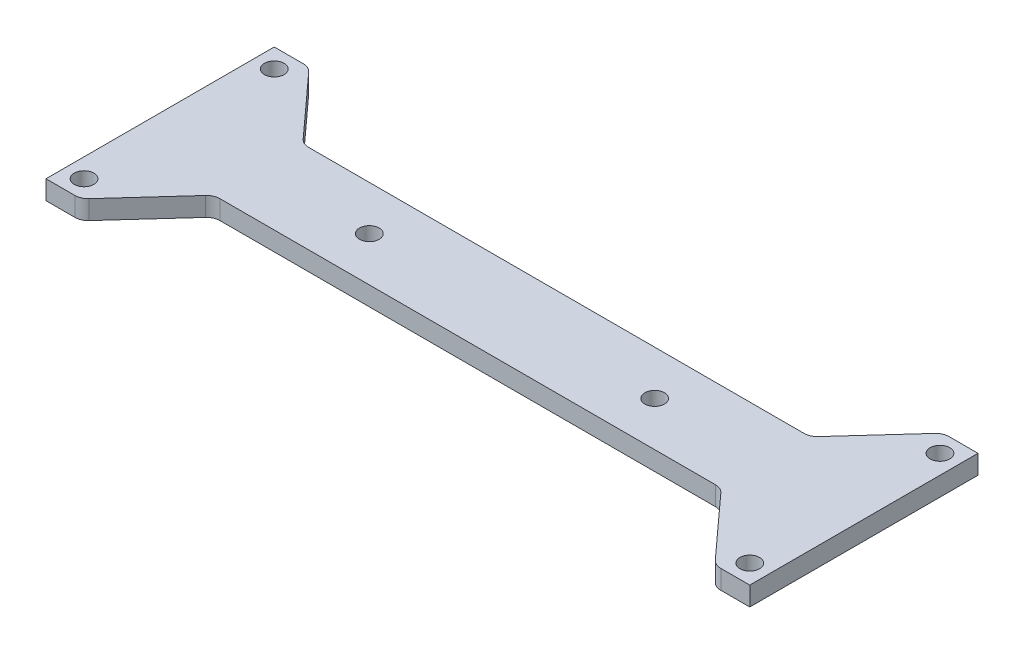
ISO-10303-21;
HEADER;
FILE_DESCRIPTION(('STEP AP214'),'2;1');
FILE_NAME('part.step','',(''),(''),'','','');
FILE_SCHEMA(('AUTOMOTIVE_DESIGN { 1 0 10303 214 1 1 1 1 }'));
ENDSEC;
DATA;
#1=APPLICATION_CONTEXT('core data for automotive mechanical design processes');
#2=APPLICATION_PROTOCOL_DEFINITION('international standard','automotive_design',2000,#1);
#3=PRODUCT_CONTEXT('',#1,'mechanical');
#4=PRODUCT('Part','Part','',(#3));
#5=PRODUCT_RELATED_PRODUCT_CATEGORY('part','',(#4));
#6=PRODUCT_DEFINITION_FORMATION('','',#4);
#7=PRODUCT_DEFINITION_CONTEXT('part definition',#1,'design');
#8=PRODUCT_DEFINITION('design','',#6,#7);
#9=PRODUCT_DEFINITION_SHAPE('','',#8);
#10=(LENGTH_UNIT() NAMED_UNIT(*) SI_UNIT(.MILLI.,.METRE.));
#11=(NAMED_UNIT(*) PLANE_ANGLE_UNIT() SI_UNIT($,.RADIAN.));
#12=(NAMED_UNIT(*) SI_UNIT($,.STERADIAN.) SOLID_ANGLE_UNIT());
#13=UNCERTAINTY_MEASURE_WITH_UNIT(LENGTH_MEASURE(1.E-05),#10,'distance_accuracy_value','');
#14=(GEOMETRIC_REPRESENTATION_CONTEXT(3) GLOBAL_UNCERTAINTY_ASSIGNED_CONTEXT((#13)) GLOBAL_UNIT_ASSIGNED_CONTEXT((#10,
#11,#12)) REPRESENTATION_CONTEXT('',''));
#15=CARTESIAN_POINT('',(0.,0.,0.));
#16=DIRECTION('',(0.,0.,1.));
#17=DIRECTION('',(1.,0.,0.));
#18=AXIS2_PLACEMENT_3D('',#15,#16,#17);
#19=CARTESIAN_POINT('',(-55.5,3.,-18.));
#20=DIRECTION('',(0.,0.,1.));
#21=DIRECTION('',(1.,0.,0.));
#22=AXIS2_PLACEMENT_3D('',#19,#20,#21);
#23=PLANE('',#22);
#24=DIRECTION('',(-1.,0.,0.));
#25=VECTOR('',#24,1.);
#26=CARTESIAN_POINT('',(-55.5,0.,-18.));
#27=LINE('',#26,#25);
#28=CARTESIAN_POINT('',(55.5,0.,-18.));
#29=VERTEX_POINT('',#28);
#30=CARTESIAN_POINT('',(50.9289767608517,0.,-18.));
#31=VERTEX_POINT('',#30);
#32=EDGE_CURVE('E430',#29,#31,#27,.T.);
#33=ORIENTED_EDGE('',*,*,#32,.T.);
#34=DIRECTION('',(0.,1.,0.));
#35=VECTOR('',#34,1.);
#36=CARTESIAN_POINT('',(50.9289767608517,3.,-18.));
#37=LINE('',#36,#35);
#38=CARTESIAN_POINT('',(50.9289767608517,3.,-18.));
#39=VERTEX_POINT('',#38);
#40=EDGE_CURVE('E186',#31,#39,#37,.T.);
#41=ORIENTED_EDGE('',*,*,#40,.T.);
#42=DIRECTION('',(-1.,0.,0.));
#43=VECTOR('',#42,1.);
#44=CARTESIAN_POINT('',(-55.5,3.,-18.));
#45=LINE('',#44,#43);
#46=CARTESIAN_POINT('',(55.5,3.,-18.));
#47=VERTEX_POINT('',#46);
#48=EDGE_CURVE('E179',#47,#39,#45,.T.);
#49=ORIENTED_EDGE('',*,*,#48,.F.);
#50=DIRECTION('',(0.,-1.,0.));
#51=VECTOR('',#50,1.);
#52=CARTESIAN_POINT('',(55.5,3.,-18.));
#53=LINE('',#52,#51);
#54=EDGE_CURVE('E183',#47,#29,#53,.T.);
#55=ORIENTED_EDGE('',*,*,#54,.T.);
#56=EDGE_LOOP('',(#33,#41,#49,#55));
#57=FACE_BOUND('',#56,.T.);
#58=ADVANCED_FACE('F39',(#57),#23,.F.);
#59=CARTESIAN_POINT('',(-55.5,3.,18.));
#60=DIRECTION('',(0.,0.,-1.));
#61=DIRECTION('',(-1.,0.,0.));
#62=AXIS2_PLACEMENT_3D('',#59,#60,#61);
#63=PLANE('',#62);
#64=DIRECTION('',(1.,0.,0.));
#65=VECTOR('',#64,1.);
#66=CARTESIAN_POINT('',(-55.5,3.,18.));
#67=LINE('',#66,#65);
#68=CARTESIAN_POINT('',(50.9289767608517,3.,18.));
#69=VERTEX_POINT('',#68);
#70=CARTESIAN_POINT('',(55.5,3.,18.));
#71=VERTEX_POINT('',#70);
#72=EDGE_CURVE('E197',#69,#71,#67,.T.);
#73=ORIENTED_EDGE('',*,*,#72,.F.);
#74=DIRECTION('',(0.,1.,0.));
#75=VECTOR('',#74,1.);
#76=CARTESIAN_POINT('',(50.9289767608517,3.,18.));
#77=LINE('',#76,#75);
#78=CARTESIAN_POINT('',(50.9289767608517,0.,18.));
#79=VERTEX_POINT('',#78);
#80=EDGE_CURVE('E262',#69,#79,#77,.F.);
#81=ORIENTED_EDGE('',*,*,#80,.T.);
#82=DIRECTION('',(1.,0.,0.));
#83=VECTOR('',#82,1.);
#84=CARTESIAN_POINT('',(-55.5,0.,18.));
#85=LINE('',#84,#83);
#86=CARTESIAN_POINT('',(55.5,0.,18.));
#87=VERTEX_POINT('',#86);
#88=EDGE_CURVE('E436',#79,#87,#85,.T.);
#89=ORIENTED_EDGE('',*,*,#88,.T.);
#90=DIRECTION('',(0.,-1.,0.));
#91=VECTOR('',#90,1.);
#92=CARTESIAN_POINT('',(55.5,3.,18.));
#93=LINE('',#92,#91);
#94=EDGE_CURVE('E426',#71,#87,#93,.T.);
#95=ORIENTED_EDGE('',*,*,#94,.F.);
#96=EDGE_LOOP('',(#73,#81,#89,#95));
#97=FACE_BOUND('',#96,.T.);
#98=ADVANCED_FACE('F470',(#97),#63,.F.);
#99=CARTESIAN_POINT('',(0.,3.,0.));
#100=DIRECTION('',(0.,1.,0.));
#101=DIRECTION('',(0.,0.,1.));
#102=AXIS2_PLACEMENT_3D('',#99,#100,#101);
#103=PLANE('',#102);
#104=ORIENTED_EDGE('',*,*,#48,.T.);
#105=CARTESIAN_POINT('',(50.9289767608517,3.,-15.9));
#106=DIRECTION('',(0.,1.,0.));
#107=DIRECTION('',(0.,0.,1.));
#108=AXIS2_PLACEMENT_3D('',#105,#106,#107);
#109=CIRCLE('',#108,2.1);
#110=CARTESIAN_POINT('',(49.3751026067202,3.,-17.3126128673923));
#111=VERTEX_POINT('',#110);
#112=EDGE_CURVE('E227',#39,#111,#109,.T.);
#113=ORIENTED_EDGE('',*,*,#112,.T.);
#114=DIRECTION('',(0.672672793996313,0.,-0.739940073395944));
#115=VECTOR('',#114,1.);
#116=CARTESIAN_POINT('',(40.,3.,-7.));
#117=LINE('',#116,#115);
#118=CARTESIAN_POINT('',(40.6248973932798,3.,-7.68738713260774));
#119=VERTEX_POINT('',#118);
#120=EDGE_CURVE('E342',#119,#111,#117,.T.);
#121=ORIENTED_EDGE('',*,*,#120,.F.);
#122=CARTESIAN_POINT('',(39.0710232391483,3.,-9.1));
#123=DIRECTION('',(0.,1.,0.));
#124=DIRECTION('',(0.,0.,1.));
#125=AXIS2_PLACEMENT_3D('',#122,#123,#124);
#126=CIRCLE('',#125,2.1);
#127=CARTESIAN_POINT('',(39.0710232391483,3.,-7.));
#128=VERTEX_POINT('',#127);
#129=EDGE_CURVE('E292',#119,#128,#126,.F.);
#130=ORIENTED_EDGE('',*,*,#129,.T.);
#131=DIRECTION('',(1.,0.,0.));
#132=VECTOR('',#131,1.);
#133=CARTESIAN_POINT('',(-40.,3.,-7.));
#134=LINE('',#133,#132);
#135=CARTESIAN_POINT('',(-39.0710232391483,3.,-7.));
#136=VERTEX_POINT('',#135);
#137=EDGE_CURVE('E314',#136,#128,#134,.T.);
#138=ORIENTED_EDGE('',*,*,#137,.F.);
#139=CARTESIAN_POINT('',(-39.0710232391483,3.,-9.1));
#140=DIRECTION('',(0.,1.,0.));
#141=DIRECTION('',(0.,0.,1.));
#142=AXIS2_PLACEMENT_3D('',#139,#140,#141);
#143=CIRCLE('',#142,2.1);
#144=CARTESIAN_POINT('',(-40.6248973932798,3.,-7.68738713260774));
#145=VERTEX_POINT('',#144);
#146=EDGE_CURVE('E48',#136,#145,#143,.F.);
#147=ORIENTED_EDGE('',*,*,#146,.T.);
#148=DIRECTION('',(0.672672793996313,0.,0.739940073395944));
#149=VECTOR('',#148,1.);
#150=CARTESIAN_POINT('',(-50.,3.,-18.));
#151=LINE('',#150,#149);
#152=CARTESIAN_POINT('',(-49.3751026067202,3.,-17.3126128673923));
#153=VERTEX_POINT('',#152);
#154=EDGE_CURVE('E312',#153,#145,#151,.T.);
#155=ORIENTED_EDGE('',*,*,#154,.F.);
#156=CARTESIAN_POINT('',(-50.9289767608517,3.,-15.9));
#157=DIRECTION('',(0.,1.,0.));
#158=DIRECTION('',(0.,0.,1.));
#159=AXIS2_PLACEMENT_3D('',#156,#157,#158);
#160=CIRCLE('',#159,2.1);
#161=CARTESIAN_POINT('',(-50.9289767608517,3.,-18.));
#162=VERTEX_POINT('',#161);
#163=EDGE_CURVE('E212',#153,#162,#160,.T.);
#164=ORIENTED_EDGE('',*,*,#163,.T.);
#165=CARTESIAN_POINT('',(-55.5,3.,-18.));
#166=VERTEX_POINT('',#165);
#167=EDGE_CURVE('E190',#162,#166,#45,.T.);
#168=ORIENTED_EDGE('',*,*,#167,.T.);
#169=DIRECTION('',(0.,0.,1.));
#170=VECTOR('',#169,1.);
#171=CARTESIAN_POINT('',(-55.5,3.,-18.));
#172=LINE('',#171,#170);
#173=CARTESIAN_POINT('',(-55.5,3.,18.));
#174=VERTEX_POINT('',#173);
#175=EDGE_CURVE('E189',#166,#174,#172,.T.);
#176=ORIENTED_EDGE('',*,*,#175,.T.);
#177=CARTESIAN_POINT('',(-50.9289767608517,3.,18.));
#178=VERTEX_POINT('',#177);
#179=EDGE_CURVE('E422',#174,#178,#67,.T.);
#180=ORIENTED_EDGE('',*,*,#179,.T.);
#181=CARTESIAN_POINT('',(-50.9289767608517,3.,15.9));
#182=DIRECTION('',(0.,1.,0.));
#183=DIRECTION('',(0.,0.,1.));
#184=AXIS2_PLACEMENT_3D('',#181,#182,#183);
#185=CIRCLE('',#184,2.1);
#186=CARTESIAN_POINT('',(-49.3751026067202,3.,17.3126128673923));
#187=VERTEX_POINT('',#186);
#188=EDGE_CURVE('E221',#178,#187,#185,.T.);
#189=ORIENTED_EDGE('',*,*,#188,.T.);
#190=DIRECTION('',(-0.672672793996312,0.,0.739940073395944));
#191=VECTOR('',#190,1.);
#192=CARTESIAN_POINT('',(-50.,3.,18.));
#193=LINE('',#192,#191);
#194=CARTESIAN_POINT('',(-40.6248973932798,3.,7.68738713260774));
#195=VERTEX_POINT('',#194);
#196=EDGE_CURVE('E355',#195,#187,#193,.T.);
#197=ORIENTED_EDGE('',*,*,#196,.F.);
#198=CARTESIAN_POINT('',(-39.0710232391483,3.,9.1));
#199=DIRECTION('',(0.,1.,0.));
#200=DIRECTION('',(0.,0.,1.));
#201=AXIS2_PLACEMENT_3D('',#198,#199,#200);
#202=CIRCLE('',#201,2.1);
#203=CARTESIAN_POINT('',(-39.0710232391483,3.,7.));
#204=VERTEX_POINT('',#203);
#205=EDGE_CURVE('E304',#195,#204,#202,.F.);
#206=ORIENTED_EDGE('',*,*,#205,.T.);
#207=DIRECTION('',(-1.,0.,0.));
#208=VECTOR('',#207,1.);
#209=CARTESIAN_POINT('',(-40.,3.,7.));
#210=LINE('',#209,#208);
#211=CARTESIAN_POINT('',(39.0710232391482,3.,7.00000000000002));
#212=VERTEX_POINT('',#211);
#213=EDGE_CURVE('E366',#212,#204,#210,.T.);
#214=ORIENTED_EDGE('',*,*,#213,.F.);
#215=CARTESIAN_POINT('',(39.0710232391482,3.,9.10000000000002));
#216=DIRECTION('',(0.,1.,0.));
#217=DIRECTION('',(0.,0.,1.));
#218=AXIS2_PLACEMENT_3D('',#215,#216,#217);
#219=CIRCLE('',#218,2.1);
#220=CARTESIAN_POINT('',(40.6248973932797,3.,7.68738713260776));
#221=VERTEX_POINT('',#220);
#222=EDGE_CURVE('E298',#212,#221,#219,.F.);
#223=ORIENTED_EDGE('',*,*,#222,.T.);
#224=DIRECTION('',(-0.672672793996315,0.,-0.739940073395941));
#225=VECTOR('',#224,1.);
#226=CARTESIAN_POINT('',(39.9999999999999,3.,7.00000000000002));
#227=LINE('',#226,#225);
#228=CARTESIAN_POINT('',(49.3751026067202,3.,17.3126128673923));
#229=VERTEX_POINT('',#228);
#230=EDGE_CURVE('E362',#229,#221,#227,.T.);
#231=ORIENTED_EDGE('',*,*,#230,.F.);
#232=CARTESIAN_POINT('',(50.9289767608517,3.,15.9));
#233=DIRECTION('',(0.,1.,0.));
#234=DIRECTION('',(0.,0.,1.));
#235=AXIS2_PLACEMENT_3D('',#232,#233,#234);
#236=CIRCLE('',#235,2.1);
#237=EDGE_CURVE('E224',#229,#69,#236,.T.);
#238=ORIENTED_EDGE('',*,*,#237,.T.);
#239=ORIENTED_EDGE('',*,*,#72,.T.);
#240=DIRECTION('',(0.,0.,-1.));
#241=VECTOR('',#240,1.);
#242=CARTESIAN_POINT('',(55.5,3.,-18.));
#243=LINE('',#242,#241);
#244=EDGE_CURVE('E193',#71,#47,#243,.T.);
#245=ORIENTED_EDGE('',*,*,#244,.T.);
#246=EDGE_LOOP('',(#104,#113,#121,#130,#138,#147,#155,#164,#168,#176,#180,#189,#197,#206,#214,
#223,#231,#238,#239,#245));
#247=FACE_BOUND('',#246,.T.);
#248=CARTESIAN_POINT('',(-22.5,3.,0.));
#249=DIRECTION('',(0.,1.,0.));
#250=DIRECTION('',(0.,0.,1.));
#251=AXIS2_PLACEMENT_3D('',#248,#249,#250);
#252=CIRCLE('',#251,1.55);
#253=CARTESIAN_POINT('',(-22.5,3.,1.55));
#254=VERTEX_POINT('',#253);
#255=EDGE_CURVE('E381',#254,#254,#252,.T.);
#256=ORIENTED_EDGE('',*,*,#255,.F.);
#257=EDGE_LOOP('',(#256));
#258=FACE_BOUND('',#257,.T.);
#259=CARTESIAN_POINT('',(52.5,3.,15.));
#260=DIRECTION('',(0.,1.,0.));
#261=DIRECTION('',(0.,0.,1.));
#262=AXIS2_PLACEMENT_3D('',#259,#260,#261);
#263=CIRCLE('',#262,1.55);
#264=CARTESIAN_POINT('',(52.5,3.,16.55));
#265=VERTEX_POINT('',#264);
#266=EDGE_CURVE('E397',#265,#265,#263,.T.);
#267=ORIENTED_EDGE('',*,*,#266,.F.);
#268=EDGE_LOOP('',(#267));
#269=FACE_BOUND('',#268,.T.);
#270=CARTESIAN_POINT('',(-52.5,3.,-15.));
#271=DIRECTION('',(0.,1.,0.));
#272=DIRECTION('',(0.,0.,1.));
#273=AXIS2_PLACEMENT_3D('',#270,#271,#272);
#274=CIRCLE('',#273,1.55);
#275=CARTESIAN_POINT('',(-52.5,3.,-13.45));
#276=VERTEX_POINT('',#275);
#277=EDGE_CURVE('E413',#276,#276,#274,.T.);
#278=ORIENTED_EDGE('',*,*,#277,.F.);
#279=EDGE_LOOP('',(#278));
#280=FACE_BOUND('',#279,.T.);
#281=CARTESIAN_POINT('',(-52.5,3.,15.));
#282=DIRECTION('',(0.,1.,0.));
#283=DIRECTION('',(0.,0.,1.));
#284=AXIS2_PLACEMENT_3D('',#281,#282,#283);
#285=CIRCLE('',#284,1.55);
#286=CARTESIAN_POINT('',(-52.5,3.,16.55));
#287=VERTEX_POINT('',#286);
#288=EDGE_CURVE('E405',#287,#287,#285,.T.);
#289=ORIENTED_EDGE('',*,*,#288,.F.);
#290=EDGE_LOOP('',(#289));
#291=FACE_BOUND('',#290,.T.);
#292=CARTESIAN_POINT('',(52.5,3.,-15.));
#293=DIRECTION('',(0.,1.,0.));
#294=DIRECTION('',(0.,0.,1.));
#295=AXIS2_PLACEMENT_3D('',#292,#293,#294);
#296=CIRCLE('',#295,1.55);
#297=CARTESIAN_POINT('',(52.5,3.,-13.45));
#298=VERTEX_POINT('',#297);
#299=EDGE_CURVE('E389',#298,#298,#296,.T.);
#300=ORIENTED_EDGE('',*,*,#299,.F.);
#301=EDGE_LOOP('',(#300));
#302=FACE_BOUND('',#301,.T.);
#303=CARTESIAN_POINT('',(22.5,3.,0.));
#304=DIRECTION('',(0.,1.,0.));
#305=DIRECTION('',(0.,0.,1.));
#306=AXIS2_PLACEMENT_3D('',#303,#304,#305);
#307=CIRCLE('',#306,1.55);
#308=CARTESIAN_POINT('',(22.5,3.,1.54999999999999));
#309=VERTEX_POINT('',#308);
#310=EDGE_CURVE('E373',#309,#309,#307,.T.);
#311=ORIENTED_EDGE('',*,*,#310,.F.);
#312=EDGE_LOOP('',(#311));
#313=FACE_BOUND('',#312,.T.);
#314=ADVANCED_FACE('F194',(#247,#258,#269,#280,#291,#302,#313),#103,.T.);
#315=CARTESIAN_POINT('',(0.,0.,0.));
#316=DIRECTION('',(0.,1.,0.));
#317=DIRECTION('',(0.,0.,1.));
#318=AXIS2_PLACEMENT_3D('',#315,#316,#317);
#319=PLANE('',#318);
#320=DIRECTION('',(0.672672793996313,0.,-0.739940073395944));
#321=VECTOR('',#320,1.);
#322=CARTESIAN_POINT('',(40.,0.,-7.));
#323=LINE('',#322,#321);
#324=CARTESIAN_POINT('',(40.6248973932798,0.,-7.68738713260774));
#325=VERTEX_POINT('',#324);
#326=CARTESIAN_POINT('',(49.3751026067202,0.,-17.3126128673923));
#327=VERTEX_POINT('',#326);
#328=EDGE_CURVE('E336',#325,#327,#323,.T.);
#329=ORIENTED_EDGE('',*,*,#328,.T.);
#330=CARTESIAN_POINT('',(50.9289767608517,0.,-15.9));
#331=DIRECTION('',(0.,1.,0.));
#332=DIRECTION('',(0.,0.,1.));
#333=AXIS2_PLACEMENT_3D('',#330,#331,#332);
#334=CIRCLE('',#333,2.1);
#335=EDGE_CURVE('E245',#327,#31,#334,.F.);
#336=ORIENTED_EDGE('',*,*,#335,.T.);
#337=ORIENTED_EDGE('',*,*,#32,.F.);
#338=DIRECTION('',(0.,0.,-1.));
#339=VECTOR('',#338,1.);
#340=CARTESIAN_POINT('',(55.5,0.,-18.));
#341=LINE('',#340,#339);
#342=EDGE_CURVE('E206',#87,#29,#341,.T.);
#343=ORIENTED_EDGE('',*,*,#342,.F.);
#344=ORIENTED_EDGE('',*,*,#88,.F.);
#345=CARTESIAN_POINT('',(50.9289767608517,0.,15.9));
#346=DIRECTION('',(0.,1.,0.));
#347=DIRECTION('',(0.,0.,1.));
#348=AXIS2_PLACEMENT_3D('',#345,#346,#347);
#349=CIRCLE('',#348,2.1);
#350=CARTESIAN_POINT('',(49.3751026067202,0.,17.3126128673923));
#351=VERTEX_POINT('',#350);
#352=EDGE_CURVE('E242',#79,#351,#349,.F.);
#353=ORIENTED_EDGE('',*,*,#352,.T.);
#354=DIRECTION('',(-0.672672793996315,0.,-0.739940073395941));
#355=VECTOR('',#354,1.);
#356=CARTESIAN_POINT('',(39.9999999999999,0.,7.00000000000002));
#357=LINE('',#356,#355);
#358=CARTESIAN_POINT('',(40.6248973932797,0.,7.68738713260776));
#359=VERTEX_POINT('',#358);
#360=EDGE_CURVE('E350',#351,#359,#357,.T.);
#361=ORIENTED_EDGE('',*,*,#360,.T.);
#362=CARTESIAN_POINT('',(39.0710232391482,0.,9.10000000000002));
#363=DIRECTION('',(0.,1.,0.));
#364=DIRECTION('',(0.,0.,1.));
#365=AXIS2_PLACEMENT_3D('',#362,#363,#364);
#366=CIRCLE('',#365,2.1);
#367=CARTESIAN_POINT('',(39.0710232391482,0.,7.00000000000002));
#368=VERTEX_POINT('',#367);
#369=EDGE_CURVE('E301',#359,#368,#366,.T.);
#370=ORIENTED_EDGE('',*,*,#369,.T.);
#371=DIRECTION('',(-1.,0.,0.));
#372=VECTOR('',#371,1.);
#373=CARTESIAN_POINT('',(-40.,0.,7.));
#374=LINE('',#373,#372);
#375=CARTESIAN_POINT('',(-39.0710232391483,0.,7.));
#376=VERTEX_POINT('',#375);
#377=EDGE_CURVE('E354',#368,#376,#374,.T.);
#378=ORIENTED_EDGE('',*,*,#377,.T.);
#379=CARTESIAN_POINT('',(-39.0710232391483,0.,9.1));
#380=DIRECTION('',(0.,1.,0.));
#381=DIRECTION('',(0.,0.,1.));
#382=AXIS2_PLACEMENT_3D('',#379,#380,#381);
#383=CIRCLE('',#382,2.1);
#384=CARTESIAN_POINT('',(-40.6248973932798,0.,7.68738713260774));
#385=VERTEX_POINT('',#384);
#386=EDGE_CURVE('E307',#376,#385,#383,.T.);
#387=ORIENTED_EDGE('',*,*,#386,.T.);
#388=DIRECTION('',(-0.672672793996312,0.,0.739940073395944));
#389=VECTOR('',#388,1.);
#390=CARTESIAN_POINT('',(-50.,0.,18.));
#391=LINE('',#390,#389);
#392=CARTESIAN_POINT('',(-49.3751026067202,0.,17.3126128673923));
#393=VERTEX_POINT('',#392);
#394=EDGE_CURVE('E320',#385,#393,#391,.T.);
#395=ORIENTED_EDGE('',*,*,#394,.T.);
#396=CARTESIAN_POINT('',(-50.9289767608517,0.,15.9));
#397=DIRECTION('',(0.,1.,0.));
#398=DIRECTION('',(0.,0.,1.));
#399=AXIS2_PLACEMENT_3D('',#396,#397,#398);
#400=CIRCLE('',#399,2.1);
#401=CARTESIAN_POINT('',(-50.9289767608517,0.,18.));
#402=VERTEX_POINT('',#401);
#403=EDGE_CURVE('E239',#393,#402,#400,.F.);
#404=ORIENTED_EDGE('',*,*,#403,.T.);
#405=CARTESIAN_POINT('',(-55.5,0.,18.));
#406=VERTEX_POINT('',#405);
#407=EDGE_CURVE('E202',#406,#402,#85,.T.);
#408=ORIENTED_EDGE('',*,*,#407,.F.);
#409=DIRECTION('',(0.,0.,1.));
#410=VECTOR('',#409,1.);
#411=CARTESIAN_POINT('',(-55.5,0.,-18.));
#412=LINE('',#411,#410);
#413=CARTESIAN_POINT('',(-55.5,0.,-18.));
#414=VERTEX_POINT('',#413);
#415=EDGE_CURVE('E433',#414,#406,#412,.T.);
#416=ORIENTED_EDGE('',*,*,#415,.F.);
#417=CARTESIAN_POINT('',(-50.9289767608517,0.,-18.));
#418=VERTEX_POINT('',#417);
#419=EDGE_CURVE('E429',#418,#414,#27,.T.);
#420=ORIENTED_EDGE('',*,*,#419,.F.);
#421=CARTESIAN_POINT('',(-50.9289767608517,0.,-15.9));
#422=DIRECTION('',(0.,1.,0.));
#423=DIRECTION('',(0.,0.,1.));
#424=AXIS2_PLACEMENT_3D('',#421,#422,#423);
#425=CIRCLE('',#424,2.1);
#426=CARTESIAN_POINT('',(-49.3751026067202,0.,-17.3126128673923));
#427=VERTEX_POINT('',#426);
#428=EDGE_CURVE('E62',#418,#427,#425,.F.);
#429=ORIENTED_EDGE('',*,*,#428,.T.);
#430=DIRECTION('',(0.672672793996313,0.,0.739940073395944));
#431=VECTOR('',#430,1.);
#432=CARTESIAN_POINT('',(-50.,0.,-18.));
#433=LINE('',#432,#431);
#434=CARTESIAN_POINT('',(-40.6248973932798,0.,-7.68738713260774));
#435=VERTEX_POINT('',#434);
#436=EDGE_CURVE('E331',#427,#435,#433,.T.);
#437=ORIENTED_EDGE('',*,*,#436,.T.);
#438=CARTESIAN_POINT('',(-39.0710232391483,0.,-9.1));
#439=DIRECTION('',(0.,1.,0.));
#440=DIRECTION('',(0.,0.,1.));
#441=AXIS2_PLACEMENT_3D('',#438,#439,#440);
#442=CIRCLE('',#441,2.1);
#443=CARTESIAN_POINT('',(-39.0710232391483,0.,-7.));
#444=VERTEX_POINT('',#443);
#445=EDGE_CURVE('E11',#435,#444,#442,.T.);
#446=ORIENTED_EDGE('',*,*,#445,.T.);
#447=DIRECTION('',(1.,0.,0.));
#448=VECTOR('',#447,1.);
#449=CARTESIAN_POINT('',(-40.,0.,-7.));
#450=LINE('',#449,#448);
#451=CARTESIAN_POINT('',(39.0710232391483,0.,-7.));
#452=VERTEX_POINT('',#451);
#453=EDGE_CURVE('E329',#444,#452,#450,.T.);
#454=ORIENTED_EDGE('',*,*,#453,.T.);
#455=CARTESIAN_POINT('',(39.0710232391483,0.,-9.1));
#456=DIRECTION('',(0.,1.,0.));
#457=DIRECTION('',(0.,0.,1.));
#458=AXIS2_PLACEMENT_3D('',#455,#456,#457);
#459=CIRCLE('',#458,2.1);
#460=EDGE_CURVE('E295',#452,#325,#459,.T.);
#461=ORIENTED_EDGE('',*,*,#460,.T.);
#462=EDGE_LOOP('',(#329,#336,#337,#343,#344,#353,#361,#370,#378,#387,#395,#404,#408,#416,#420,
#429,#437,#446,#454,#461));
#463=FACE_BOUND('',#462,.T.);
#464=CARTESIAN_POINT('',(-52.5,0.,-15.));
#465=DIRECTION('',(0.,1.,0.));
#466=DIRECTION('',(0.,0.,1.));
#467=AXIS2_PLACEMENT_3D('',#464,#465,#466);
#468=CIRCLE('',#467,1.55);
#469=CARTESIAN_POINT('',(-52.5,0.,-13.45));
#470=VERTEX_POINT('',#469);
#471=EDGE_CURVE('E409',#470,#470,#468,.T.);
#472=ORIENTED_EDGE('',*,*,#471,.T.);
#473=EDGE_LOOP('',(#472));
#474=FACE_BOUND('',#473,.T.);
#475=CARTESIAN_POINT('',(-52.5,0.,15.));
#476=DIRECTION('',(0.,1.,0.));
#477=DIRECTION('',(0.,0.,1.));
#478=AXIS2_PLACEMENT_3D('',#475,#476,#477);
#479=CIRCLE('',#478,1.55);
#480=CARTESIAN_POINT('',(-52.5,0.,16.55));
#481=VERTEX_POINT('',#480);
#482=EDGE_CURVE('E401',#481,#481,#479,.T.);
#483=ORIENTED_EDGE('',*,*,#482,.T.);
#484=EDGE_LOOP('',(#483));
#485=FACE_BOUND('',#484,.T.);
#486=CARTESIAN_POINT('',(52.5,0.,15.));
#487=DIRECTION('',(0.,1.,0.));
#488=DIRECTION('',(0.,0.,1.));
#489=AXIS2_PLACEMENT_3D('',#486,#487,#488);
#490=CIRCLE('',#489,1.55);
#491=CARTESIAN_POINT('',(52.5,0.,16.55));
#492=VERTEX_POINT('',#491);
#493=EDGE_CURVE('E393',#492,#492,#490,.T.);
#494=ORIENTED_EDGE('',*,*,#493,.T.);
#495=EDGE_LOOP('',(#494));
#496=FACE_BOUND('',#495,.T.);
#497=CARTESIAN_POINT('',(52.5,0.,-15.));
#498=DIRECTION('',(0.,1.,0.));
#499=DIRECTION('',(0.,0.,1.));
#500=AXIS2_PLACEMENT_3D('',#497,#498,#499);
#501=CIRCLE('',#500,1.55);
#502=CARTESIAN_POINT('',(52.5,0.,-13.45));
#503=VERTEX_POINT('',#502);
#504=EDGE_CURVE('E385',#503,#503,#501,.T.);
#505=ORIENTED_EDGE('',*,*,#504,.T.);
#506=EDGE_LOOP('',(#505));
#507=FACE_BOUND('',#506,.T.);
#508=CARTESIAN_POINT('',(-22.5,0.,0.));
#509=DIRECTION('',(0.,1.,0.));
#510=DIRECTION('',(0.,0.,1.));
#511=AXIS2_PLACEMENT_3D('',#508,#509,#510);
#512=CIRCLE('',#511,1.55);
#513=CARTESIAN_POINT('',(-22.5,0.,1.55));
#514=VERTEX_POINT('',#513);
#515=EDGE_CURVE('E377',#514,#514,#512,.T.);
#516=ORIENTED_EDGE('',*,*,#515,.T.);
#517=EDGE_LOOP('',(#516));
#518=FACE_BOUND('',#517,.T.);
#519=CARTESIAN_POINT('',(22.5,0.,0.));
#520=DIRECTION('',(0.,1.,0.));
#521=DIRECTION('',(0.,0.,1.));
#522=AXIS2_PLACEMENT_3D('',#519,#520,#521);
#523=CIRCLE('',#522,1.55);
#524=CARTESIAN_POINT('',(22.5,0.,1.54999999999999));
#525=VERTEX_POINT('',#524);
#526=EDGE_CURVE('E340',#525,#525,#523,.T.);
#527=ORIENTED_EDGE('',*,*,#526,.T.);
#528=EDGE_LOOP('',(#527));
#529=FACE_BOUND('',#528,.T.);
#530=ADVANCED_FACE('F327',(#463,#474,#485,#496,#507,#518,#529),#319,.F.);
#531=CARTESIAN_POINT('',(55.5,3.,-18.));
#532=DIRECTION('',(-1.,0.,0.));
#533=DIRECTION('',(0.,0.,1.));
#534=AXIS2_PLACEMENT_3D('',#531,#532,#533);
#535=PLANE('',#534);
#536=ORIENTED_EDGE('',*,*,#342,.T.);
#537=ORIENTED_EDGE('',*,*,#54,.F.);
#538=ORIENTED_EDGE('',*,*,#244,.F.);
#539=ORIENTED_EDGE('',*,*,#94,.T.);
#540=EDGE_LOOP('',(#536,#537,#538,#539));
#541=FACE_BOUND('',#540,.T.);
#542=ADVANCED_FACE('F204',(#541),#535,.F.);
#543=ORIENTED_EDGE('',*,*,#167,.F.);
#544=DIRECTION('',(0.,1.,0.));
#545=VECTOR('',#544,1.);
#546=CARTESIAN_POINT('',(-50.9289767608517,3.,-18.));
#547=LINE('',#546,#545);
#548=EDGE_CURVE('E289',#162,#418,#547,.F.);
#549=ORIENTED_EDGE('',*,*,#548,.T.);
#550=ORIENTED_EDGE('',*,*,#419,.T.);
#551=DIRECTION('',(0.,-1.,0.));
#552=VECTOR('',#551,1.);
#553=CARTESIAN_POINT('',(-55.5,3.,-18.));
#554=LINE('',#553,#552);
#555=EDGE_CURVE('E208',#166,#414,#554,.T.);
#556=ORIENTED_EDGE('',*,*,#555,.F.);
#557=EDGE_LOOP('',(#543,#549,#550,#556));
#558=FACE_BOUND('',#557,.T.);
#559=ADVANCED_FACE('F462',(#558),#23,.F.);
#560=CARTESIAN_POINT('',(-55.5,3.,-18.));
#561=DIRECTION('',(1.,0.,0.));
#562=DIRECTION('',(0.,0.,-1.));
#563=AXIS2_PLACEMENT_3D('',#560,#561,#562);
#564=PLANE('',#563);
#565=ORIENTED_EDGE('',*,*,#415,.T.);
#566=DIRECTION('',(0.,-1.,0.));
#567=VECTOR('',#566,1.);
#568=CARTESIAN_POINT('',(-55.5,3.,18.));
#569=LINE('',#568,#567);
#570=EDGE_CURVE('E215',#174,#406,#569,.T.);
#571=ORIENTED_EDGE('',*,*,#570,.F.);
#572=ORIENTED_EDGE('',*,*,#175,.F.);
#573=ORIENTED_EDGE('',*,*,#555,.T.);
#574=EDGE_LOOP('',(#565,#571,#572,#573));
#575=FACE_BOUND('',#574,.T.);
#576=ADVANCED_FACE('F460',(#575),#564,.F.);
#577=ORIENTED_EDGE('',*,*,#407,.T.);
#578=DIRECTION('',(0.,1.,0.));
#579=VECTOR('',#578,1.);
#580=CARTESIAN_POINT('',(-50.9289767608517,3.,18.));
#581=LINE('',#580,#579);
#582=EDGE_CURVE('E279',#402,#178,#581,.T.);
#583=ORIENTED_EDGE('',*,*,#582,.T.);
#584=ORIENTED_EDGE('',*,*,#179,.F.);
#585=ORIENTED_EDGE('',*,*,#570,.T.);
#586=EDGE_LOOP('',(#577,#583,#584,#585));
#587=FACE_BOUND('',#586,.T.);
#588=ADVANCED_FACE('F447',(#587),#63,.F.);
#589=CARTESIAN_POINT('',(-52.5,3.,-15.));
#590=DIRECTION('',(0.,-1.,0.));
#591=DIRECTION('',(0.,0.,-1.));
#592=AXIS2_PLACEMENT_3D('',#589,#590,#591);
#593=CYLINDRICAL_SURFACE('',#592,1.55);
#594=ORIENTED_EDGE('',*,*,#277,.T.);
#595=EDGE_LOOP('',(#594));
#596=FACE_BOUND('',#595,.T.);
#597=ORIENTED_EDGE('',*,*,#471,.F.);
#598=EDGE_LOOP('',(#597));
#599=FACE_BOUND('',#598,.T.);
#600=ADVANCED_FACE('F518',(#596,#599),#593,.F.);
#601=CARTESIAN_POINT('',(-52.5,3.,15.));
#602=DIRECTION('',(0.,-1.,0.));
#603=DIRECTION('',(0.,0.,-1.));
#604=AXIS2_PLACEMENT_3D('',#601,#602,#603);
#605=CYLINDRICAL_SURFACE('',#604,1.55);
#606=ORIENTED_EDGE('',*,*,#288,.T.);
#607=EDGE_LOOP('',(#606));
#608=FACE_BOUND('',#607,.T.);
#609=ORIENTED_EDGE('',*,*,#482,.F.);
#610=EDGE_LOOP('',(#609));
#611=FACE_BOUND('',#610,.T.);
#612=ADVANCED_FACE('F522',(#608,#611),#605,.F.);
#613=CARTESIAN_POINT('',(52.5,3.,15.));
#614=DIRECTION('',(0.,-1.,0.));
#615=DIRECTION('',(0.,0.,-1.));
#616=AXIS2_PLACEMENT_3D('',#613,#614,#615);
#617=CYLINDRICAL_SURFACE('',#616,1.55);
#618=ORIENTED_EDGE('',*,*,#266,.T.);
#619=EDGE_LOOP('',(#618));
#620=FACE_BOUND('',#619,.T.);
#621=ORIENTED_EDGE('',*,*,#493,.F.);
#622=EDGE_LOOP('',(#621));
#623=FACE_BOUND('',#622,.T.);
#624=ADVANCED_FACE('F527',(#620,#623),#617,.F.);
#625=CARTESIAN_POINT('',(52.5,3.,-15.));
#626=DIRECTION('',(0.,-1.,0.));
#627=DIRECTION('',(0.,0.,-1.));
#628=AXIS2_PLACEMENT_3D('',#625,#626,#627);
#629=CYLINDRICAL_SURFACE('',#628,1.55);
#630=ORIENTED_EDGE('',*,*,#299,.T.);
#631=EDGE_LOOP('',(#630));
#632=FACE_BOUND('',#631,.T.);
#633=ORIENTED_EDGE('',*,*,#504,.F.);
#634=EDGE_LOOP('',(#633));
#635=FACE_BOUND('',#634,.T.);
#636=ADVANCED_FACE('F534',(#632,#635),#629,.F.);
#637=CARTESIAN_POINT('',(-22.5,3.,0.));
#638=DIRECTION('',(0.,-1.,0.));
#639=DIRECTION('',(0.,0.,-1.));
#640=AXIS2_PLACEMENT_3D('',#637,#638,#639);
#641=CYLINDRICAL_SURFACE('',#640,1.55);
#642=ORIENTED_EDGE('',*,*,#255,.T.);
#643=EDGE_LOOP('',(#642));
#644=FACE_BOUND('',#643,.T.);
#645=ORIENTED_EDGE('',*,*,#515,.F.);
#646=EDGE_LOOP('',(#645));
#647=FACE_BOUND('',#646,.T.);
#648=ADVANCED_FACE('F538',(#644,#647),#641,.F.);
#649=CARTESIAN_POINT('',(22.5,3.,0.));
#650=DIRECTION('',(0.,-1.,0.));
#651=DIRECTION('',(0.,0.,-1.));
#652=AXIS2_PLACEMENT_3D('',#649,#650,#651);
#653=CYLINDRICAL_SURFACE('',#652,1.55);
#654=ORIENTED_EDGE('',*,*,#310,.T.);
#655=EDGE_LOOP('',(#654));
#656=FACE_BOUND('',#655,.T.);
#657=ORIENTED_EDGE('',*,*,#526,.F.);
#658=EDGE_LOOP('',(#657));
#659=FACE_BOUND('',#658,.T.);
#660=ADVANCED_FACE('F542',(#656,#659),#653,.F.);
#661=CARTESIAN_POINT('',(39.9999999999999,0.,7.00000000000002));
#662=DIRECTION('',(0.739940073395941,0.,-0.672672793996315));
#663=DIRECTION('',(-0.672672793996315,0.,-0.739940073395941));
#664=AXIS2_PLACEMENT_3D('',#661,#662,#663);
#665=PLANE('',#664);
#666=ORIENTED_EDGE('',*,*,#360,.F.);
#667=DIRECTION('',(0.,1.,0.));
#668=VECTOR('',#667,1.);
#669=CARTESIAN_POINT('',(49.3751026067202,0.,17.3126128673923));
#670=LINE('',#669,#668);
#671=EDGE_CURVE('E258',#351,#229,#670,.T.);
#672=ORIENTED_EDGE('',*,*,#671,.T.);
#673=ORIENTED_EDGE('',*,*,#230,.T.);
#674=DIRECTION('',(0.,1.,0.));
#675=VECTOR('',#674,1.);
#676=CARTESIAN_POINT('',(40.6248973932797,0.,7.68738713260777));
#677=LINE('',#676,#675);
#678=EDGE_CURVE('E255',#221,#359,#677,.F.);
#679=ORIENTED_EDGE('',*,*,#678,.T.);
#680=EDGE_LOOP('',(#666,#672,#673,#679));
#681=FACE_BOUND('',#680,.T.);
#682=ADVANCED_FACE('F546',(#681),#665,.F.);
#683=CARTESIAN_POINT('',(-50.,0.,18.));
#684=DIRECTION('',(-0.739940073395944,0.,-0.672672793996312));
#685=DIRECTION('',(-0.672672793996312,0.,0.739940073395944));
#686=AXIS2_PLACEMENT_3D('',#683,#684,#685);
#687=PLANE('',#686);
#688=ORIENTED_EDGE('',*,*,#394,.F.);
#689=DIRECTION('',(0.,1.,0.));
#690=VECTOR('',#689,1.);
#691=CARTESIAN_POINT('',(-40.6248973932798,3.,7.68738713260774));
#692=LINE('',#691,#690);
#693=EDGE_CURVE('E275',#385,#195,#692,.T.);
#694=ORIENTED_EDGE('',*,*,#693,.T.);
#695=ORIENTED_EDGE('',*,*,#196,.T.);
#696=DIRECTION('',(0.,1.,0.));
#697=VECTOR('',#696,1.);
#698=CARTESIAN_POINT('',(-49.3751026067202,0.,17.3126128673923));
#699=LINE('',#698,#697);
#700=EDGE_CURVE('E272',#187,#393,#699,.F.);
#701=ORIENTED_EDGE('',*,*,#700,.T.);
#702=EDGE_LOOP('',(#688,#694,#695,#701));
#703=FACE_BOUND('',#702,.T.);
#704=ADVANCED_FACE('F550',(#703),#687,.F.);
#705=CARTESIAN_POINT('',(-40.,0.,7.));
#706=DIRECTION('',(0.,0.,-1.));
#707=DIRECTION('',(-1.,0.,0.));
#708=AXIS2_PLACEMENT_3D('',#705,#706,#707);
#709=PLANE('',#708);
#710=ORIENTED_EDGE('',*,*,#377,.F.);
#711=DIRECTION('',(0.,1.,0.));
#712=VECTOR('',#711,1.);
#713=CARTESIAN_POINT('',(39.0710232391482,3.,7.00000000000002));
#714=LINE('',#713,#712);
#715=EDGE_CURVE('E268',#368,#212,#714,.T.);
#716=ORIENTED_EDGE('',*,*,#715,.T.);
#717=ORIENTED_EDGE('',*,*,#213,.T.);
#718=DIRECTION('',(0.,1.,0.));
#719=VECTOR('',#718,1.);
#720=CARTESIAN_POINT('',(-39.0710232391483,0.,7.));
#721=LINE('',#720,#719);
#722=EDGE_CURVE('E265',#204,#376,#721,.F.);
#723=ORIENTED_EDGE('',*,*,#722,.T.);
#724=EDGE_LOOP('',(#710,#716,#717,#723));
#725=FACE_BOUND('',#724,.T.);
#726=ADVANCED_FACE('F552',(#725),#709,.F.);
#727=CARTESIAN_POINT('',(40.,0.,-7.));
#728=DIRECTION('',(0.739940073395944,0.,0.672672793996312));
#729=DIRECTION('',(0.672672793996313,0.,-0.739940073395944));
#730=AXIS2_PLACEMENT_3D('',#727,#728,#729);
#731=PLANE('',#730);
#732=ORIENTED_EDGE('',*,*,#120,.T.);
#733=DIRECTION('',(0.,1.,0.));
#734=VECTOR('',#733,1.);
#735=CARTESIAN_POINT('',(49.3751026067202,0.,-17.3126128673923));
#736=LINE('',#735,#734);
#737=EDGE_CURVE('E234',#111,#327,#736,.F.);
#738=ORIENTED_EDGE('',*,*,#737,.T.);
#739=ORIENTED_EDGE('',*,*,#328,.F.);
#740=DIRECTION('',(0.,1.,0.));
#741=VECTOR('',#740,1.);
#742=CARTESIAN_POINT('',(40.6248973932798,3.,-7.68738713260774));
#743=LINE('',#742,#741);
#744=EDGE_CURVE('E230',#325,#119,#743,.T.);
#745=ORIENTED_EDGE('',*,*,#744,.T.);
#746=EDGE_LOOP('',(#732,#738,#739,#745));
#747=FACE_BOUND('',#746,.T.);
#748=ADVANCED_FACE('F479',(#747),#731,.F.);
#749=CARTESIAN_POINT('',(-40.,0.,-7.));
#750=DIRECTION('',(0.,0.,1.));
#751=DIRECTION('',(1.,0.,0.));
#752=AXIS2_PLACEMENT_3D('',#749,#750,#751);
#753=PLANE('',#752);
#754=ORIENTED_EDGE('',*,*,#137,.T.);
#755=DIRECTION('',(0.,1.,0.));
#756=VECTOR('',#755,1.);
#757=CARTESIAN_POINT('',(39.0710232391483,0.,-7.));
#758=LINE('',#757,#756);
#759=EDGE_CURVE('E252',#128,#452,#758,.F.);
#760=ORIENTED_EDGE('',*,*,#759,.T.);
#761=ORIENTED_EDGE('',*,*,#453,.F.);
#762=DIRECTION('',(0.,1.,0.));
#763=VECTOR('',#762,1.);
#764=CARTESIAN_POINT('',(-39.0710232391483,3.,-7.));
#765=LINE('',#764,#763);
#766=EDGE_CURVE('E248',#444,#136,#765,.T.);
#767=ORIENTED_EDGE('',*,*,#766,.T.);
#768=EDGE_LOOP('',(#754,#760,#761,#767));
#769=FACE_BOUND('',#768,.T.);
#770=ADVANCED_FACE('F333',(#769),#753,.F.);
#771=CARTESIAN_POINT('',(-50.,0.,-18.));
#772=DIRECTION('',(-0.739940073395944,0.,0.672672793996312));
#773=DIRECTION('',(0.672672793996313,0.,0.739940073395944));
#774=AXIS2_PLACEMENT_3D('',#771,#772,#773);
#775=PLANE('',#774);
#776=ORIENTED_EDGE('',*,*,#154,.T.);
#777=DIRECTION('',(0.,1.,0.));
#778=VECTOR('',#777,1.);
#779=CARTESIAN_POINT('',(-40.6248973932798,0.,-7.68738713260774));
#780=LINE('',#779,#778);
#781=EDGE_CURVE('E55',#145,#435,#780,.F.);
#782=ORIENTED_EDGE('',*,*,#781,.T.);
#783=ORIENTED_EDGE('',*,*,#436,.F.);
#784=DIRECTION('',(0.,1.,0.));
#785=VECTOR('',#784,1.);
#786=CARTESIAN_POINT('',(-49.3751026067202,0.,-17.3126128673923));
#787=LINE('',#786,#785);
#788=EDGE_CURVE('E283',#427,#153,#787,.T.);
#789=ORIENTED_EDGE('',*,*,#788,.T.);
#790=EDGE_LOOP('',(#776,#782,#783,#789));
#791=FACE_BOUND('',#790,.T.);
#792=ADVANCED_FACE('F317',(#791),#775,.F.);
#793=CARTESIAN_POINT('',(50.9289767608517,3.,-15.9));
#794=DIRECTION('',(0.,1.,0.));
#795=DIRECTION('',(0.,0.,1.));
#796=AXIS2_PLACEMENT_3D('',#793,#794,#795);
#797=CYLINDRICAL_SURFACE('',#796,2.1);
#798=ORIENTED_EDGE('',*,*,#335,.F.);
#799=ORIENTED_EDGE('',*,*,#737,.F.);
#800=ORIENTED_EDGE('',*,*,#112,.F.);
#801=ORIENTED_EDGE('',*,*,#40,.F.);
#802=EDGE_LOOP('',(#798,#799,#800,#801));
#803=FACE_BOUND('',#802,.T.);
#804=ADVANCED_FACE('F475',(#803),#797,.T.);
#805=CARTESIAN_POINT('',(39.0710232391483,0.,-9.1));
#806=DIRECTION('',(0.,-1.,0.));
#807=DIRECTION('',(0.,0.,-1.));
#808=AXIS2_PLACEMENT_3D('',#805,#806,#807);
#809=CYLINDRICAL_SURFACE('',#808,2.1);
#810=ORIENTED_EDGE('',*,*,#460,.F.);
#811=ORIENTED_EDGE('',*,*,#759,.F.);
#812=ORIENTED_EDGE('',*,*,#129,.F.);
#813=ORIENTED_EDGE('',*,*,#744,.F.);
#814=EDGE_LOOP('',(#810,#811,#812,#813));
#815=FACE_BOUND('',#814,.T.);
#816=ADVANCED_FACE('F483',(#815),#809,.F.);
#817=CARTESIAN_POINT('',(50.9289767608517,0.,15.9));
#818=DIRECTION('',(0.,1.,0.));
#819=DIRECTION('',(0.,0.,1.));
#820=AXIS2_PLACEMENT_3D('',#817,#818,#819);
#821=CYLINDRICAL_SURFACE('',#820,2.1);
#822=ORIENTED_EDGE('',*,*,#352,.F.);
#823=ORIENTED_EDGE('',*,*,#80,.F.);
#824=ORIENTED_EDGE('',*,*,#237,.F.);
#825=ORIENTED_EDGE('',*,*,#671,.F.);
#826=EDGE_LOOP('',(#822,#823,#824,#825));
#827=FACE_BOUND('',#826,.T.);
#828=ADVANCED_FACE('F485',(#827),#821,.T.);
#829=CARTESIAN_POINT('',(39.0710232391482,0.,9.10000000000002));
#830=DIRECTION('',(0.,-1.,0.));
#831=DIRECTION('',(0.,0.,-1.));
#832=AXIS2_PLACEMENT_3D('',#829,#830,#831);
#833=CYLINDRICAL_SURFACE('',#832,2.1);
#834=ORIENTED_EDGE('',*,*,#369,.F.);
#835=ORIENTED_EDGE('',*,*,#678,.F.);
#836=ORIENTED_EDGE('',*,*,#222,.F.);
#837=ORIENTED_EDGE('',*,*,#715,.F.);
#838=EDGE_LOOP('',(#834,#835,#836,#837));
#839=FACE_BOUND('',#838,.T.);
#840=ADVANCED_FACE('F491',(#839),#833,.F.);
#841=CARTESIAN_POINT('',(-39.0710232391483,0.,9.1));
#842=DIRECTION('',(0.,-1.,0.));
#843=DIRECTION('',(0.,0.,-1.));
#844=AXIS2_PLACEMENT_3D('',#841,#842,#843);
#845=CYLINDRICAL_SURFACE('',#844,2.1);
#846=ORIENTED_EDGE('',*,*,#386,.F.);
#847=ORIENTED_EDGE('',*,*,#722,.F.);
#848=ORIENTED_EDGE('',*,*,#205,.F.);
#849=ORIENTED_EDGE('',*,*,#693,.F.);
#850=EDGE_LOOP('',(#846,#847,#848,#849));
#851=FACE_BOUND('',#850,.T.);
#852=ADVANCED_FACE('F599',(#851),#845,.F.);
#853=CARTESIAN_POINT('',(-50.9289767608517,3.,15.9));
#854=DIRECTION('',(0.,1.,0.));
#855=DIRECTION('',(0.,0.,1.));
#856=AXIS2_PLACEMENT_3D('',#853,#854,#855);
#857=CYLINDRICAL_SURFACE('',#856,2.1);
#858=ORIENTED_EDGE('',*,*,#403,.F.);
#859=ORIENTED_EDGE('',*,*,#700,.F.);
#860=ORIENTED_EDGE('',*,*,#188,.F.);
#861=ORIENTED_EDGE('',*,*,#582,.F.);
#862=EDGE_LOOP('',(#858,#859,#860,#861));
#863=FACE_BOUND('',#862,.T.);
#864=ADVANCED_FACE('F456',(#863),#857,.T.);
#865=CARTESIAN_POINT('',(-39.0710232391483,0.,-9.1));
#866=DIRECTION('',(0.,-1.,0.));
#867=DIRECTION('',(0.,0.,-1.));
#868=AXIS2_PLACEMENT_3D('',#865,#866,#867);
#869=CYLINDRICAL_SURFACE('',#868,2.1);
#870=ORIENTED_EDGE('',*,*,#445,.F.);
#871=ORIENTED_EDGE('',*,*,#781,.F.);
#872=ORIENTED_EDGE('',*,*,#146,.F.);
#873=ORIENTED_EDGE('',*,*,#766,.F.);
#874=EDGE_LOOP('',(#870,#871,#872,#873));
#875=FACE_BOUND('',#874,.T.);
#876=ADVANCED_FACE('F323',(#875),#869,.F.);
#877=CARTESIAN_POINT('',(-50.9289767608517,0.,-15.9));
#878=DIRECTION('',(0.,1.,0.));
#879=DIRECTION('',(0.,0.,1.));
#880=AXIS2_PLACEMENT_3D('',#877,#878,#879);
#881=CYLINDRICAL_SURFACE('',#880,2.1);
#882=ORIENTED_EDGE('',*,*,#428,.F.);
#883=ORIENTED_EDGE('',*,*,#548,.F.);
#884=ORIENTED_EDGE('',*,*,#163,.F.);
#885=ORIENTED_EDGE('',*,*,#788,.F.);
#886=EDGE_LOOP('',(#882,#883,#884,#885));
#887=FACE_BOUND('',#886,.T.);
#888=ADVANCED_FACE('F41',(#887),#881,.T.);
#889=CLOSED_SHELL('',(#58,#98,#314,#530,#542,#559,#576,#588,#600,#612,#624,#636,#648,#660,#682,
#704,#726,#748,#770,#792,#804,#816,#828,#840,#852,#864,#876,#888));
#890=MANIFOLD_SOLID_BREP('B2',#889);
#891=ADVANCED_BREP_SHAPE_REPRESENTATION('',(#18,#890),#14);
#892=SHAPE_DEFINITION_REPRESENTATION(#9,#891);
ENDSEC;
END-ISO-10303-21;
